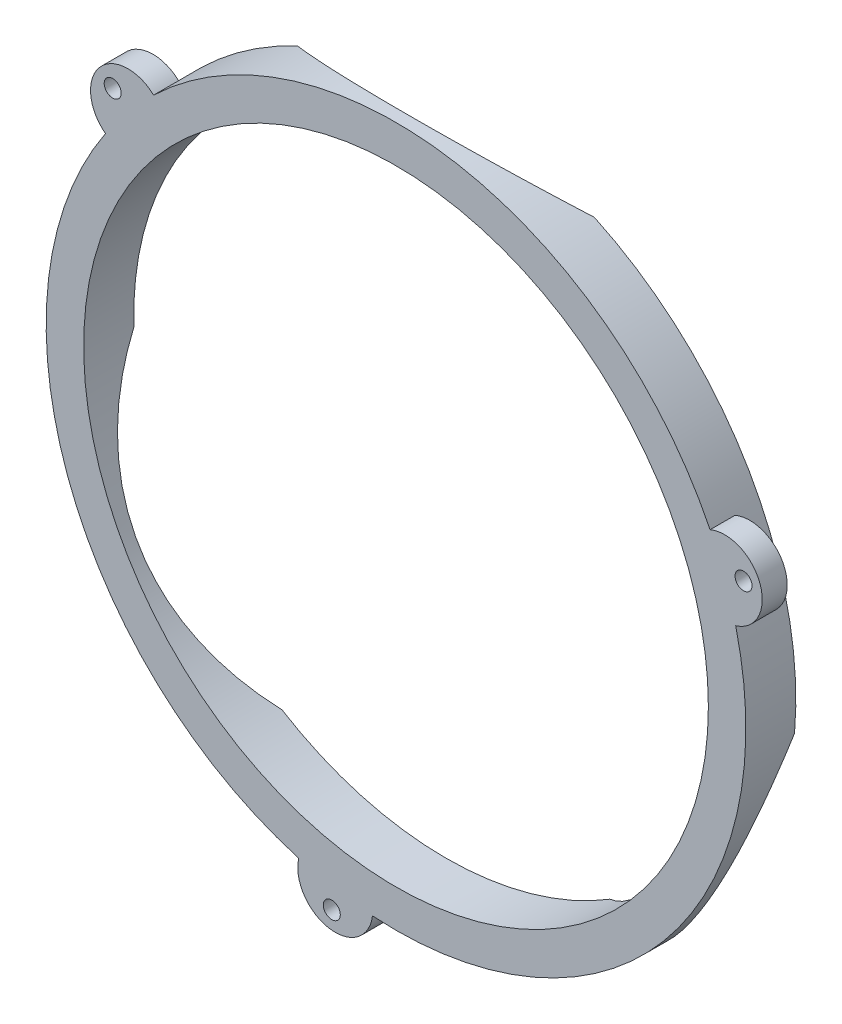
ISO-10303-21;
HEADER;
FILE_DESCRIPTION(('STEP AP214'),'2;1');
FILE_NAME('part.step','',(''),(''),'','','');
FILE_SCHEMA(('AUTOMOTIVE_DESIGN { 1 0 10303 214 1 1 1 1 }'));
ENDSEC;
DATA;
#1=APPLICATION_CONTEXT('core data for automotive mechanical design processes');
#2=APPLICATION_PROTOCOL_DEFINITION('international standard','automotive_design',2000,#1);
#3=PRODUCT_CONTEXT('',#1,'mechanical');
#4=PRODUCT('Part','Part','',(#3));
#5=PRODUCT_RELATED_PRODUCT_CATEGORY('part','',(#4));
#6=PRODUCT_DEFINITION_FORMATION('','',#4);
#7=PRODUCT_DEFINITION_CONTEXT('part definition',#1,'design');
#8=PRODUCT_DEFINITION('design','',#6,#7);
#9=PRODUCT_DEFINITION_SHAPE('','',#8);
#10=(LENGTH_UNIT() NAMED_UNIT(*) SI_UNIT(.MILLI.,.METRE.));
#11=(NAMED_UNIT(*) PLANE_ANGLE_UNIT() SI_UNIT($,.RADIAN.));
#12=(NAMED_UNIT(*) SI_UNIT($,.STERADIAN.) SOLID_ANGLE_UNIT());
#13=UNCERTAINTY_MEASURE_WITH_UNIT(LENGTH_MEASURE(1.E-05),#10,'distance_accuracy_value','');
#14=(GEOMETRIC_REPRESENTATION_CONTEXT(3) GLOBAL_UNCERTAINTY_ASSIGNED_CONTEXT((#13)) GLOBAL_UNIT_ASSIGNED_CONTEXT((#10,
#11,#12)) REPRESENTATION_CONTEXT('',''));
#15=CARTESIAN_POINT('',(0.,0.,0.));
#16=DIRECTION('',(0.,0.,1.));
#17=DIRECTION('',(1.,0.,0.));
#18=AXIS2_PLACEMENT_3D('',#15,#16,#17);
#19=CARTESIAN_POINT('',(0.,0.,0.));
#20=DIRECTION('',(0.,0.,1.));
#21=DIRECTION('',(1.,0.,0.));
#22=AXIS2_PLACEMENT_3D('',#19,#20,#21);
#23=PLANE('',#22);
#24=CARTESIAN_POINT('',(0.,0.,0.));
#25=DIRECTION('',(0.,0.,1.));
#26=DIRECTION('',(1.,0.,0.));
#27=AXIS2_PLACEMENT_3D('',#24,#25,#26);
#28=CIRCLE('',#27,62.5);
#29=CARTESIAN_POINT('',(-32.7884695993469,-53.2087047515038,0.));
#30=VERTEX_POINT('',#29);
#31=CARTESIAN_POINT('',(32.7884695993469,-53.2087047515038,0.));
#32=VERTEX_POINT('',#31);
#33=EDGE_CURVE('E148',#30,#32,#28,.T.);
#34=ORIENTED_EDGE('',*,*,#33,.T.);
#35=DIRECTION('',(0.86602540378444,-0.499999999999998,0.));
#36=VECTOR('',#35,1.);
#37=CARTESIAN_POINT('',(19.7980885425803,-45.7087047515039,0.));
#38=LINE('',#37,#36);
#39=CARTESIAN_POINT('',(40.0575505311971,-57.4055105842687,0.));
#40=VERTEX_POINT('',#39);
#41=EDGE_CURVE('E61',#32,#40,#38,.T.);
#42=ORIENTED_EDGE('',*,*,#41,.T.);
#43=CARTESIAN_POINT('',(0.,0.,0.));
#44=DIRECTION('',(0.,0.,1.));
#45=DIRECTION('',(1.,0.,0.));
#46=AXIS2_PLACEMENT_3D('',#43,#44,#45);
#47=CIRCLE('',#46,70.);
#48=CARTESIAN_POINT('',(-40.0575505311971,-57.4055105842688,0.));
#49=VERTEX_POINT('',#48);
#50=EDGE_CURVE('E162',#49,#40,#47,.T.);
#51=ORIENTED_EDGE('',*,*,#50,.F.);
#52=DIRECTION('',(-0.86602540378444,-0.499999999999998,0.));
#53=VECTOR('',#52,1.);
#54=CARTESIAN_POINT('',(-19.7980885425803,-45.7087047515039,0.));
#55=LINE('',#54,#53);
#56=EDGE_CURVE('E332',#49,#30,#55,.F.);
#57=ORIENTED_EDGE('',*,*,#56,.T.);
#58=EDGE_LOOP('',(#34,#42,#51,#57));
#59=FACE_BOUND('',#58,.T.);
#60=ADVANCED_FACE('F38',(#59),#23,.F.);
#61=CARTESIAN_POINT('',(69.7434057487918,-5.98810108126087,0.));
#62=VERTEX_POINT('',#61);
#63=CARTESIAN_POINT('',(29.6858552175943,63.3936116655301,0.));
#64=VERTEX_POINT('',#63);
#65=EDGE_CURVE('E160',#62,#64,#47,.T.);
#66=ORIENTED_EDGE('',*,*,#65,.F.);
#67=DIRECTION('',(0.86602540378444,-0.499999999999998,0.));
#68=VECTOR('',#67,1.);
#69=CARTESIAN_POINT('',(49.4839437601749,5.708704751504,0.));
#70=LINE('',#69,#68);
#71=CARTESIAN_POINT('',(62.4743248169415,-1.79129524849596,0.));
#72=VERTEX_POINT('',#71);
#73=EDGE_CURVE('E290',#62,#72,#70,.F.);
#74=ORIENTED_EDGE('',*,*,#73,.T.);
#75=CARTESIAN_POINT('',(29.6858552175944,55.0000000000002,0.));
#76=VERTEX_POINT('',#75);
#77=EDGE_CURVE('E145',#72,#76,#28,.T.);
#78=ORIENTED_EDGE('',*,*,#77,.T.);
#79=DIRECTION('',(0.,1.,0.));
#80=VECTOR('',#79,1.);
#81=CARTESIAN_POINT('',(29.6858552175945,40.0000000000002,0.));
#82=LINE('',#81,#80);
#83=EDGE_CURVE('E54',#76,#64,#82,.T.);
#84=ORIENTED_EDGE('',*,*,#83,.T.);
#85=EDGE_LOOP('',(#66,#74,#78,#84));
#86=FACE_BOUND('',#85,.T.);
#87=ADVANCED_FACE('F247',(#86),#23,.F.);
#88=CARTESIAN_POINT('',(-26.8115555091644,22.4975663390287,5.));
#89=DIRECTION('',(0.,0.,1.));
#90=DIRECTION('',(1.,0.,0.));
#91=AXIS2_PLACEMENT_3D('',#88,#89,#90);
#92=PLANE('',#91);
#93=CARTESIAN_POINT('',(-53.6231110183289,44.9951326780573,5.));
#94=DIRECTION('',(0.,0.,1.));
#95=DIRECTION('',(1.,0.,0.));
#96=AXIS2_PLACEMENT_3D('',#93,#94,#95);
#97=CIRCLE('',#96,7.5);
#98=CARTESIAN_POINT('',(-48.5013409580594,50.4739529388185,5.));
#99=VERTEX_POINT('',#98);
#100=CARTESIAN_POINT('',(-58.1293096510919,38.9997866595123,5.));
#101=VERTEX_POINT('',#100);
#102=EDGE_CURVE('E201',#99,#101,#97,.T.);
#103=ORIENTED_EDGE('',*,*,#102,.F.);
#104=CARTESIAN_POINT('',(0.,0.,5.));
#105=DIRECTION('',(0.,0.,1.));
#106=DIRECTION('',(1.,0.,0.));
#107=AXIS2_PLACEMENT_3D('',#104,#105,#106);
#108=CIRCLE('',#107,70.);
#109=EDGE_CURVE('E196',#99,#101,#108,.T.);
#110=ORIENTED_EDGE('',*,*,#109,.T.);
#111=EDGE_LOOP('',(#103,#110));
#112=FACE_BOUND('',#111,.T.);
#113=CARTESIAN_POINT('',(-56.6872887908048,47.5662831168035,5.));
#114=DIRECTION('',(0.,0.,-1.));
#115=DIRECTION('',(-1.,0.,0.));
#116=AXIS2_PLACEMENT_3D('',#113,#114,#115);
#117=CIRCLE('',#116,1.69999999999999);
#118=CARTESIAN_POINT('',(-58.3872887908047,47.5662831168035,5.));
#119=VERTEX_POINT('',#118);
#120=EDGE_CURVE('E214',#119,#119,#117,.T.);
#121=ORIENTED_EDGE('',*,*,#120,.F.);
#122=EDGE_LOOP('',(#121));
#123=FACE_BOUND('',#122,.T.);
#124=ADVANCED_FACE('F243',(#112,#123),#92,.F.);
#125=CARTESIAN_POINT('',(32.8892417275068,11.9707050163985,5.));
#126=DIRECTION('',(0.,0.,1.));
#127=DIRECTION('',(1.,0.,0.));
#128=AXIS2_PLACEMENT_3D('',#125,#126,#127);
#129=PLANE('',#128);
#130=CARTESIAN_POINT('',(65.7784834550136,23.9414100327971,5.));
#131=DIRECTION('',(0.,0.,1.));
#132=DIRECTION('',(1.,0.,0.));
#133=AXIS2_PLACEMENT_3D('',#130,#131,#132);
#134=CIRCLE('',#133,7.5);
#135=CARTESIAN_POINT('',(67.9623959534669,16.7664169178806,5.));
#136=VERTEX_POINT('',#135);
#137=CARTESIAN_POINT('',(62.8394608148572,30.8415655325411,5.));
#138=VERTEX_POINT('',#137);
#139=EDGE_CURVE('E188',#136,#138,#134,.T.);
#140=ORIENTED_EDGE('',*,*,#139,.F.);
#141=CARTESIAN_POINT('',(0.,0.,5.));
#142=DIRECTION('',(0.,0.,1.));
#143=DIRECTION('',(1.,0.,0.));
#144=AXIS2_PLACEMENT_3D('',#141,#142,#143);
#145=CIRCLE('',#144,70.);
#146=EDGE_CURVE('E183',#136,#138,#145,.T.);
#147=ORIENTED_EDGE('',*,*,#146,.T.);
#148=EDGE_LOOP('',(#140,#147));
#149=FACE_BOUND('',#148,.T.);
#150=CARTESIAN_POINT('',(69.5372539381571,25.3094906060997,5.));
#151=DIRECTION('',(0.,0.,-1.));
#152=DIRECTION('',(-1.,0.,0.));
#153=AXIS2_PLACEMENT_3D('',#150,#151,#152);
#154=CIRCLE('',#153,1.69999999999999);
#155=CARTESIAN_POINT('',(67.8372539381571,25.3094906060997,5.));
#156=VERTEX_POINT('',#155);
#157=EDGE_CURVE('E208',#156,#156,#154,.T.);
#158=ORIENTED_EDGE('',*,*,#157,.F.);
#159=EDGE_LOOP('',(#158));
#160=FACE_BOUND('',#159,.T.);
#161=ADVANCED_FACE('F246',(#149,#160),#129,.F.);
#162=CARTESIAN_POINT('',(-6.0776862183426,-34.4682713554273,5.));
#163=DIRECTION('',(0.,0.,1.));
#164=DIRECTION('',(1.,0.,0.));
#165=AXIS2_PLACEMENT_3D('',#162,#163,#164);
#166=PLANE('',#165);
#167=CARTESIAN_POINT('',(-12.1553724366852,-68.9365427108546,5.));
#168=DIRECTION('',(0.,0.,1.));
#169=DIRECTION('',(1.,0.,0.));
#170=AXIS2_PLACEMENT_3D('',#167,#168,#169);
#171=CIRCLE('',#170,7.5);
#172=CARTESIAN_POINT('',(-19.461054995408,-67.2403698566992,5.));
#173=VERTEX_POINT('',#172);
#174=CARTESIAN_POINT('',(-4.71015116376576,-69.8413521920536,5.));
#175=VERTEX_POINT('',#174);
#176=EDGE_CURVE('E169',#173,#175,#171,.T.);
#177=ORIENTED_EDGE('',*,*,#176,.F.);
#178=CARTESIAN_POINT('',(0.,0.,5.));
#179=DIRECTION('',(0.,0.,1.));
#180=DIRECTION('',(1.,0.,0.));
#181=AXIS2_PLACEMENT_3D('',#178,#179,#180);
#182=CIRCLE('',#181,70.);
#183=EDGE_CURVE('E165',#173,#175,#182,.T.);
#184=ORIENTED_EDGE('',*,*,#183,.T.);
#185=EDGE_LOOP('',(#177,#184));
#186=FACE_BOUND('',#185,.T.);
#187=CARTESIAN_POINT('',(-12.8499651473529,-72.8757737229034,5.));
#188=DIRECTION('',(0.,0.,-1.));
#189=DIRECTION('',(-1.,0.,0.));
#190=AXIS2_PLACEMENT_3D('',#187,#188,#189);
#191=CIRCLE('',#190,1.69999999999999);
#192=CARTESIAN_POINT('',(-14.5499651473529,-72.8757737229034,5.));
#193=VERTEX_POINT('',#192);
#194=EDGE_CURVE('E176',#193,#193,#191,.T.);
#195=ORIENTED_EDGE('',*,*,#194,.F.);
#196=EDGE_LOOP('',(#195));
#197=FACE_BOUND('',#196,.T.);
#198=ADVANCED_FACE('F255',(#186,#197),#166,.F.);
#199=CARTESIAN_POINT('',(0.,0.,10.));
#200=DIRECTION('',(0.,0.,1.));
#201=DIRECTION('',(1.,0.,0.));
#202=AXIS2_PLACEMENT_3D('',#199,#200,#201);
#203=PLANE('',#202);
#204=CARTESIAN_POINT('',(-56.6872887908048,47.5662831168035,10.));
#205=DIRECTION('',(0.,0.,1.));
#206=DIRECTION('',(1.,0.,0.));
#207=AXIS2_PLACEMENT_3D('',#204,#205,#206);
#208=CIRCLE('',#207,1.69999999999999);
#209=CARTESIAN_POINT('',(-54.9872887908048,47.5662831168035,10.));
#210=VERTEX_POINT('',#209);
#211=EDGE_CURVE('E211',#210,#210,#208,.T.);
#212=ORIENTED_EDGE('',*,*,#211,.F.);
#213=EDGE_LOOP('',(#212));
#214=FACE_BOUND('',#213,.T.);
#215=CARTESIAN_POINT('',(69.5372539381571,25.3094906060997,10.));
#216=DIRECTION('',(0.,0.,1.));
#217=DIRECTION('',(1.,0.,0.));
#218=AXIS2_PLACEMENT_3D('',#215,#216,#217);
#219=CIRCLE('',#218,1.69999999999999);
#220=CARTESIAN_POINT('',(71.2372539381571,25.3094906060997,10.));
#221=VERTEX_POINT('',#220);
#222=EDGE_CURVE('E202',#221,#221,#219,.T.);
#223=ORIENTED_EDGE('',*,*,#222,.F.);
#224=EDGE_LOOP('',(#223));
#225=FACE_BOUND('',#224,.T.);
#226=CARTESIAN_POINT('',(-12.8499651473529,-72.8757737229034,10.));
#227=DIRECTION('',(0.,0.,1.));
#228=DIRECTION('',(1.,0.,0.));
#229=AXIS2_PLACEMENT_3D('',#226,#227,#228);
#230=CIRCLE('',#229,1.69999999999999);
#231=CARTESIAN_POINT('',(-11.1499651473529,-72.8757737229034,10.));
#232=VERTEX_POINT('',#231);
#233=EDGE_CURVE('E170',#232,#232,#230,.T.);
#234=ORIENTED_EDGE('',*,*,#233,.F.);
#235=EDGE_LOOP('',(#234));
#236=FACE_BOUND('',#235,.T.);
#237=CARTESIAN_POINT('',(0.,0.,10.));
#238=DIRECTION('',(0.,0.,1.));
#239=DIRECTION('',(1.,0.,0.));
#240=AXIS2_PLACEMENT_3D('',#237,#238,#239);
#241=CIRCLE('',#240,70.);
#242=CARTESIAN_POINT('',(-4.71015116376576,-69.8413521920537,10.));
#243=VERTEX_POINT('',#242);
#244=CARTESIAN_POINT('',(67.9623959534669,16.7664169178806,10.));
#245=VERTEX_POINT('',#244);
#246=EDGE_CURVE('E295',#243,#245,#241,.T.);
#247=ORIENTED_EDGE('',*,*,#246,.T.);
#248=CARTESIAN_POINT('',(65.7784834550136,23.9414100327971,10.));
#249=DIRECTION('',(0.,0.,1.));
#250=DIRECTION('',(1.,0.,0.));
#251=AXIS2_PLACEMENT_3D('',#248,#249,#250);
#252=CIRCLE('',#251,7.5);
#253=CARTESIAN_POINT('',(62.8394608148572,30.8415655325411,10.));
#254=VERTEX_POINT('',#253);
#255=EDGE_CURVE('E186',#245,#254,#252,.T.);
#256=ORIENTED_EDGE('',*,*,#255,.T.);
#257=CARTESIAN_POINT('',(-48.5013409580594,50.4739529388185,10.));
#258=VERTEX_POINT('',#257);
#259=EDGE_CURVE('E298',#254,#258,#241,.T.);
#260=ORIENTED_EDGE('',*,*,#259,.T.);
#261=CARTESIAN_POINT('',(-53.6231110183289,44.9951326780573,10.));
#262=DIRECTION('',(0.,0.,1.));
#263=DIRECTION('',(1.,0.,0.));
#264=AXIS2_PLACEMENT_3D('',#261,#262,#263);
#265=CIRCLE('',#264,7.5);
#266=CARTESIAN_POINT('',(-58.129309651092,38.9997866595123,10.));
#267=VERTEX_POINT('',#266);
#268=EDGE_CURVE('E199',#258,#267,#265,.T.);
#269=ORIENTED_EDGE('',*,*,#268,.T.);
#270=CARTESIAN_POINT('',(-19.461054995408,-67.2403698566992,10.));
#271=VERTEX_POINT('',#270);
#272=EDGE_CURVE('E293',#267,#271,#241,.T.);
#273=ORIENTED_EDGE('',*,*,#272,.T.);
#274=CARTESIAN_POINT('',(-12.1553724366852,-68.9365427108546,10.));
#275=DIRECTION('',(0.,0.,1.));
#276=DIRECTION('',(1.,0.,0.));
#277=AXIS2_PLACEMENT_3D('',#274,#275,#276);
#278=CIRCLE('',#277,7.5);
#279=EDGE_CURVE('E167',#271,#243,#278,.T.);
#280=ORIENTED_EDGE('',*,*,#279,.T.);
#281=EDGE_LOOP('',(#247,#256,#260,#269,#273,#280));
#282=FACE_BOUND('',#281,.T.);
#283=CARTESIAN_POINT('',(0.,0.,10.));
#284=DIRECTION('',(0.,0.,1.));
#285=DIRECTION('',(1.,0.,0.));
#286=AXIS2_PLACEMENT_3D('',#283,#284,#285);
#287=CIRCLE('',#286,62.5);
#288=CARTESIAN_POINT('',(62.5,0.,10.));
#289=VERTEX_POINT('',#288);
#290=EDGE_CURVE('E155',#289,#289,#287,.T.);
#291=ORIENTED_EDGE('',*,*,#290,.F.);
#292=EDGE_LOOP('',(#291));
#293=FACE_BOUND('',#292,.T.);
#294=ADVANCED_FACE('F267',(#214,#225,#236,#282,#293),#203,.T.);
#295=CARTESIAN_POINT('',(-29.6858552175952,63.3936116655296,0.));
#296=VERTEX_POINT('',#295);
#297=CARTESIAN_POINT('',(-69.7434057487918,-5.98810108126087,0.));
#298=VERTEX_POINT('',#297);
#299=EDGE_CURVE('E139',#296,#298,#47,.T.);
#300=ORIENTED_EDGE('',*,*,#299,.F.);
#301=DIRECTION('',(0.,1.,0.));
#302=VECTOR('',#301,1.);
#303=CARTESIAN_POINT('',(-29.6858552175951,39.9999999999998,0.));
#304=LINE('',#303,#302);
#305=CARTESIAN_POINT('',(-29.6858552175952,54.9999999999998,0.));
#306=VERTEX_POINT('',#305);
#307=EDGE_CURVE('E127',#296,#306,#304,.F.);
#308=ORIENTED_EDGE('',*,*,#307,.T.);
#309=CARTESIAN_POINT('',(-62.4743248169415,-1.79129524849595,0.));
#310=VERTEX_POINT('',#309);
#311=EDGE_CURVE('E137',#306,#310,#28,.T.);
#312=ORIENTED_EDGE('',*,*,#311,.T.);
#313=DIRECTION('',(-0.86602540378444,-0.499999999999998,0.));
#314=VECTOR('',#313,1.);
#315=CARTESIAN_POINT('',(-49.4839437601749,5.708704751504,0.));
#316=LINE('',#315,#314);
#317=EDGE_CURVE('E224',#310,#298,#316,.T.);
#318=ORIENTED_EDGE('',*,*,#317,.T.);
#319=EDGE_LOOP('',(#300,#308,#312,#318));
#320=FACE_BOUND('',#319,.T.);
#321=ADVANCED_FACE('F135',(#320),#23,.F.);
#322=CARTESIAN_POINT('',(0.,0.,10.));
#323=DIRECTION('',(0.,0.,-1.));
#324=DIRECTION('',(-1.,0.,0.));
#325=AXIS2_PLACEMENT_3D('',#322,#323,#324);
#326=CYLINDRICAL_SURFACE('',#325,70.);
#327=ORIENTED_EDGE('',*,*,#109,.F.);
#328=DIRECTION('',(0.,0.,1.));
#329=VECTOR('',#328,1.);
#330=CARTESIAN_POINT('',(-48.5013409580594,50.4739529388185,5.));
#331=LINE('',#330,#329);
#332=EDGE_CURVE('E189',#99,#258,#331,.T.);
#333=ORIENTED_EDGE('',*,*,#332,.T.);
#334=ORIENTED_EDGE('',*,*,#259,.F.);
#335=DIRECTION('',(0.,0.,1.));
#336=VECTOR('',#335,1.);
#337=CARTESIAN_POINT('',(62.8394608148572,30.8415655325411,5.));
#338=LINE('',#337,#336);
#339=EDGE_CURVE('E180',#138,#254,#338,.T.);
#340=ORIENTED_EDGE('',*,*,#339,.F.);
#341=ORIENTED_EDGE('',*,*,#146,.F.);
#342=DIRECTION('',(0.,0.,1.));
#343=VECTOR('',#342,1.);
#344=CARTESIAN_POINT('',(67.9623959534669,16.7664169178806,5.));
#345=LINE('',#344,#343);
#346=EDGE_CURVE('E179',#136,#245,#345,.T.);
#347=ORIENTED_EDGE('',*,*,#346,.T.);
#348=ORIENTED_EDGE('',*,*,#246,.F.);
#349=DIRECTION('',(0.,0.,1.));
#350=VECTOR('',#349,1.);
#351=CARTESIAN_POINT('',(-4.71015116376576,-69.8413521920536,5.));
#352=LINE('',#351,#350);
#353=EDGE_CURVE('E150',#175,#243,#352,.T.);
#354=ORIENTED_EDGE('',*,*,#353,.F.);
#355=ORIENTED_EDGE('',*,*,#183,.F.);
#356=DIRECTION('',(0.,0.,1.));
#357=VECTOR('',#356,1.);
#358=CARTESIAN_POINT('',(-19.461054995408,-67.2403698566992,5.));
#359=LINE('',#358,#357);
#360=EDGE_CURVE('E146',#173,#271,#359,.T.);
#361=ORIENTED_EDGE('',*,*,#360,.T.);
#362=ORIENTED_EDGE('',*,*,#272,.F.);
#363=DIRECTION('',(0.,0.,1.));
#364=VECTOR('',#363,1.);
#365=CARTESIAN_POINT('',(-58.1293096510919,38.9997866595123,5.));
#366=LINE('',#365,#364);
#367=EDGE_CURVE('E193',#101,#267,#366,.T.);
#368=ORIENTED_EDGE('',*,*,#367,.F.);
#369=EDGE_LOOP('',(#327,#333,#334,#340,#341,#347,#348,#354,#355,#361,#362,#368));
#370=FACE_BOUND('',#369,.T.);
#371=ORIENTED_EDGE('',*,*,#50,.T.);
#372=CARTESIAN_POINT('',(5.9182029186876,-69.749371855331,-30.3778554955098));
#373=CARTESIAN_POINT('',(6.31484149570612,-69.7157263904104,-29.8472070250956));
#374=CARTESIAN_POINT('',(6.71773765752362,-69.6781244892094,-29.3215140449993));
#375=CARTESIAN_POINT('',(7.53487679534848,-69.5944965867276,-28.2797450774848));
#376=CARTESIAN_POINT('',(7.94911917458296,-69.5484710277822,-27.7636685866615));
#377=CARTESIAN_POINT('',(8.78775741203566,-69.4474892088401,-26.7408645114382));
#378=CARTESIAN_POINT('',(9.21215164077977,-69.3925343739879,-26.2341354495027));
#379=CARTESIAN_POINT('',(10.0701844129512,-69.2732202892359,-25.2296988933929));
#380=CARTESIAN_POINT('',(10.5038230982167,-69.2088608949524,-24.7319915378563));
#381=CARTESIAN_POINT('',(11.8184970052836,-69.0008027494828,-23.2507067447942));
#382=CARTESIAN_POINT('',(12.7121661663452,-68.8422563068114,-22.280330296218));
#383=CARTESIAN_POINT('',(14.5270467962894,-68.4822690963951,-20.3739024089243));
#384=CARTESIAN_POINT('',(15.4482596204957,-68.2808262148764,-19.4378526643618));
#385=CARTESIAN_POINT('',(17.3228405170023,-67.8296255970889,-17.590443484262));
#386=CARTESIAN_POINT('',(18.2764414764339,-67.5793935286434,-16.6794357353063));
#387=CARTESIAN_POINT('',(20.2021899983048,-67.0289082949837,-14.892772217949));
#388=CARTESIAN_POINT('',(21.1743378015674,-66.7286544798654,-14.0171169090453));
#389=CARTESIAN_POINT('',(23.132330486881,-66.0754085068067,-12.3029851068488));
#390=CARTESIAN_POINT('',(24.1181649659889,-65.7224546067172,-11.4644822105371));
#391=CARTESIAN_POINT('',(26.1000452412946,-64.960870127397,-9.8259679695846));
#392=CARTESIAN_POINT('',(27.0960898374178,-64.5522460236752,-9.02595216278302));
#393=CARTESIAN_POINT('',(29.4060676821653,-63.5399928129061,-7.22361990291038));
#394=CARTESIAN_POINT('',(30.7223242017183,-62.9152793278979,-6.23596363048639));
#395=CARTESIAN_POINT('',(33.3558697523206,-61.55955772827,-4.3380216824035));
#396=CARTESIAN_POINT('',(34.6731586735209,-60.8285597074138,-3.4277286726063));
#397=CARTESIAN_POINT('',(37.2931013414597,-59.2583149100963,-1.6964454371918));
#398=CARTESIAN_POINT('',(38.5957919596104,-58.4194970367925,-0.875123942026196));
#399=CARTESIAN_POINT('',(41.1794640796881,-56.6279215536609,0.672084612601793));
#400=CARTESIAN_POINT('',(42.4604493408212,-55.675183909006,1.39798834796251));
#401=CARTESIAN_POINT('',(44.757381686404,-53.8379936403103,2.62105975850668));
#402=CARTESIAN_POINT('',(45.7792050907559,-52.972573637459,3.1358249735337));
#403=CARTESIAN_POINT('',(47.7907976678636,-51.1650976631315,4.08774221346354));
#404=CARTESIAN_POINT('',(48.7805703528219,-50.2230501287073,4.52490276618264));
#405=CARTESIAN_POINT('',(50.7193160323263,-48.2643734812208,5.31548599889334));
#406=CARTESIAN_POINT('',(51.6682851324691,-47.2477372741659,5.66890070041398));
#407=CARTESIAN_POINT('',(53.5161418248328,-45.1440173669395,6.28628450389929));
#408=CARTESIAN_POINT('',(54.4150288280409,-44.0569328385542,6.55025255407215));
#409=CARTESIAN_POINT('',(56.1579930101882,-41.812775963112,6.98515927976403));
#410=CARTESIAN_POINT('',(57.0017713764037,-40.6553787332731,7.15562277450551));
#411=CARTESIAN_POINT('',(58.6209456659412,-38.2837579718298,7.39820726991709));
#412=CARTESIAN_POINT('',(59.3963414650226,-37.0695343369866,7.47032809191698));
#413=CARTESIAN_POINT('',(60.8712104520707,-34.5943753802657,7.51478700648723));
#414=CARTESIAN_POINT('',(61.5706982564778,-33.3334491141426,7.48714434422673));
#415=CARTESIAN_POINT('',(62.888195343591,-30.7757062684411,7.33266751578066));
#416=CARTESIAN_POINT('',(63.5062087890239,-29.4788915265929,7.20583841957254));
#417=CARTESIAN_POINT('',(64.6087207761916,-26.9709011581667,6.87022674337899));
#418=CARTESIAN_POINT('',(65.1000729371002,-25.7616780333028,6.66921993017558));
#419=CARTESIAN_POINT('',(66.0100170293705,-23.3315425679126,6.1892405410149));
#420=CARTESIAN_POINT('',(66.4286139424641,-22.1106310337653,5.91027330661449));
#421=CARTESIAN_POINT('',(67.1931294045195,-19.66531545355,5.27838264915873));
#422=CARTESIAN_POINT('',(67.5390482078579,-18.440911419721,4.92545948496092));
#423=CARTESIAN_POINT('',(68.1595041070592,-15.9960294966217,4.15024133536252));
#424=CARTESIAN_POINT('',(68.4340367914709,-14.7755518545917,3.72794206535386));
#425=CARTESIAN_POINT('',(68.9309503467061,-12.2590188212044,2.7866361674662));
#426=CARTESIAN_POINT('',(69.1482577849443,-10.9637356317389,2.26289748700554));
#427=CARTESIAN_POINT('',(69.5072408083631,-8.3922120292806,1.14750789446722));
#428=CARTESIAN_POINT('',(69.6489148464088,-7.11597200634841,0.555855593468889));
#429=CARTESIAN_POINT('',(69.861057667752,-4.5873424902562,-0.690023417015011));
#430=CARTESIAN_POINT('',(69.9314742716762,-3.33497113275861,-1.34429559771347));
#431=CARTESIAN_POINT('',(70.0056757797302,-0.859553334926287,-2.70980433916668));
#432=CARTESIAN_POINT('',(70.0094530749491,0.363489740768551,-3.42104739557227));
#433=CARTESIAN_POINT('',(69.9616384225649,2.49524166454274,-4.72390870012264));
#434=CARTESIAN_POINT('',(69.9227326588782,3.41083921055597,-5.30482548797036));
#435=CARTESIAN_POINT('',(69.8109124094167,5.22098770662377,-6.49546223165851));
#436=CARTESIAN_POINT('',(69.7379979769922,6.1155386896923,-7.10518214231339));
#437=CARTESIAN_POINT('',(69.560420952599,7.8826927684388,-8.35205221693209));
#438=CARTESIAN_POINT('',(69.4557431228898,8.75528511192197,-8.98921542000808));
#439=CARTESIAN_POINT('',(69.2169778251573,10.4768875388122,-10.2892804129949));
#440=CARTESIAN_POINT('',(69.0828912341192,11.3258983245837,-10.9521814349049));
#441=CARTESIAN_POINT('',(68.7874816134207,13.0002253251751,-12.3033717695801));
#442=CARTESIAN_POINT('',(68.6261273300365,13.825513064448,-12.9916894989119));
#443=CARTESIAN_POINT('',(68.2786814502784,15.4503017461773,-14.3921276813001));
#444=CARTESIAN_POINT('',(68.0925891832638,16.2498019888105,-15.104248779268));
#445=CARTESIAN_POINT('',(67.6982102515772,17.8215758663912,-16.5514144280462));
#446=CARTESIAN_POINT('',(67.4899315547056,18.5938591440341,-17.2864506827178));
#447=CARTESIAN_POINT('',(67.053726691808,20.1101978223956,-18.7793222502196));
#448=CARTESIAN_POINT('',(66.8258020164512,20.8542553586277,-19.5371558304316));
#449=CARTESIAN_POINT('',(66.3462739353452,22.333690471251,-21.0977365935947));
#450=CARTESIAN_POINT('',(66.0941790799868,23.0682079522793,-21.9011485238818));
#451=CARTESIAN_POINT('',(65.5754646567661,24.503894360391,-23.532326948877));
#452=CARTESIAN_POINT('',(65.3088486609907,25.2050714101783,-24.3600874311946));
#453=CARTESIAN_POINT('',(64.7659041905087,26.5690406776064,-26.0373253397897));
#454=CARTESIAN_POINT('',(64.4896228264872,27.2319861081694,-26.8866930753888));
#455=CARTESIAN_POINT('',(64.0702679933801,28.1979457579408,-28.1805658967956));
#456=CARTESIAN_POINT('',(63.9296334614191,28.5152473720472,-28.6152456763642));
#457=CARTESIAN_POINT('',(63.6473431195069,29.1398915705943,-29.491401541382));
#458=CARTESIAN_POINT('',(63.5056872704546,29.4472337712375,-29.9328778877799));
#459=CARTESIAN_POINT('',(63.3638293840676,29.7493718553311,-30.3778554955098));
#460=B_SPLINE_CURVE_WITH_KNOTS('',3,(#372,#373,#374,#375,#376,#377,#378,#379,#380,#381,#382,
#383,#384,#385,#386,#387,#388,#389,#390,#391,#392,#393,#394,#395,#396,#397,#398,#399,#400,#401,
#402,#403,#404,#405,#406,#407,#408,#409,#410,#411,#412,#413,#414,#415,#416,#417,#418,#419,#420,
#421,#422,#423,#424,#425,#426,#427,#428,#429,#430,#431,#432,#433,#434,#435,#436,#437,#438,#439,
#440,#441,#442,#443,#444,#445,#446,#447,#448,#449,#450,#451,#452,#453,#454,#455,#456,#457,#458,
#459),.UNSPECIFIED.,.F.,.F.,(4,2,2,2,2,2,2,2,2,2,2,2,2,2,2,2,2,2,2,2,2,2,2,2,2,2,2,2,2,2,2,2,2,
2,2,2,2,2,2,2,2,2,2,4),(0.,1.98997734105155,3.97985021621773,5.96940581194739,7.95899195555215,
11.9434752069455,15.928154844005,19.9537017074987,23.9793008767132,28.0019917273951,
32.0242150611099,37.3000330225726,42.5753502703935,47.8302968555172,53.0843238236051,
57.383968602145,61.6831406087195,65.982722033078,70.2823540139139,74.6036385044203,
78.9249308458803,83.245389620259,87.565627566082,91.5231007487494,95.4803028465882,
99.4374910938216,103.394923825506,107.63275799465,111.870678848386,116.111700745387,
120.353206881351,123.607216186925,126.861220387867,130.116788095131,133.372258732793,
136.631486357529,139.89080235716,143.148951761701,146.406854166339,149.75813834374,
153.10860182248,156.444541938965,158.113152415844,159.781827118274),.UNSPECIFIED.);
#461=EDGE_CURVE('E330',#40,#62,#460,.T.);
#462=ORIENTED_EDGE('',*,*,#461,.T.);
#463=ORIENTED_EDGE('',*,*,#65,.T.);
#464=CARTESIAN_POINT('',(57.44562646538,40.0000000000004,-30.3778554955098));
#465=CARTESIAN_POINT('',(57.2181693495274,40.3266763513591,-29.8472070250956));
#466=CARTESIAN_POINT('',(56.984157066948,40.6567937119798,-29.3215140449994));
#467=CARTESIAN_POINT('',(56.5031636100211,41.3226430125217,-28.2797450774849));
#468=CARTESIAN_POINT('',(56.2561831171337,41.6583746567902,-27.7636685866615));
#469=CARTESIAN_POINT('',(55.7494111778832,42.3341657655382,-26.7408645114382));
#470=CARTESIAN_POINT('',(55.4896217804684,42.674224531424,-26.2341354495027));
#471=CARTESIAN_POINT('',(54.9572763659581,43.357645667028,-25.2296988933929));
#472=CARTESIAN_POINT('',(54.6847201529037,43.7010080873899,-24.7319915378563));
#473=CARTESIAN_POINT('',(53.8471995599293,44.7355200158676,-23.2507067447942));
#474=CARTESIAN_POINT('',(53.2630597323654,45.4301869905899,-22.280330296218));
#475=CARTESIAN_POINT('',(52.0438613481353,46.8219261157497,-20.3739024089243));
#476=CARTESIAN_POINT('',(51.4088002832254,47.518998383045,-19.4378526643618));
#477=CARTESIAN_POINT('',(50.0807586377649,48.916832751975,-17.590443484262));
#478=CARTESIAN_POINT('',(49.3872508299337,49.6175593736932,-16.6794357353063));
#479=CARTESIAN_POINT('',(47.9476423722408,51.0100638981039,-14.892772217949));
#480=CARTESIAN_POINT('',(47.2015410391339,51.7018416844034,-14.0171169090454));
#481=CARTESIAN_POINT('',(45.6568170888883,53.0708901037797,-12.3029851068488));
#482=CARTESIAN_POINT('',(44.858232805492,53.748170856569,-11.4644822105371));
#483=CARTESIAN_POINT('',(43.20774116162,55.083737282583,-9.82596796958462));
#484=CARTESIAN_POINT('',(42.3558400091366,55.742025154267,-9.02595216278304));
#485=CARTESIAN_POINT('',(40.3242140911745,57.2363980446129,-7.2236199029104));
#486=CARTESIAN_POINT('',(39.1250680832941,58.0639528859387,-6.23596363048641));
#487=CARTESIAN_POINT('',(36.634205962256,59.6668094349698,-4.33802168240351));
#488=CARTESIAN_POINT('',(35.3424986454781,60.4421160944249,-3.42772867260631));
#489=CARTESIAN_POINT('',(32.6726554268715,61.9259306026599,-1.69644543719181));
#490=CARTESIAN_POINT('',(31.2948725303666,62.6346848345981,-0.87512394202622));
#491=CARTESIAN_POINT('',(28.4514865891384,63.9764227840693,0.672084612601768));
#492=CARTESIAN_POINT('',(26.9858989551589,64.6094197397564,1.3979883479625));
#493=CARTESIAN_POINT('',(24.2463793380915,65.6800263674575,2.62105975850666));
#494=CARTESIAN_POINT('',(22.9859919285031,66.1322413923821,3.13582497353369));
#495=CARTESIAN_POINT('',(20.4148755294517,66.9705936790578,4.08774221346351));
#496=CARTESIAN_POINT('',(19.1041520905886,67.3567382009915,4.52490276618261));
#497=CARTESIAN_POINT('',(16.4385155163137,68.0564028871764,5.31548599889332));
#498=CARTESIAN_POINT('',(15.0835981845258,68.369916131779,5.66890070041397));
#499=CARTESIAN_POINT('',(12.3377949562388,68.9183470163059,6.28628450389928));
#500=CARTESIAN_POINT('',(10.946908636992,69.1532637320231,6.55025255407212));
#501=CARTESIAN_POINT('',(8.13192968170795,69.540636553928,6.98515927976401));
#502=CARTESIAN_POINT('',(6.70770509529001,69.6926714393149,7.1556227745055));
#503=CARTESIAN_POINT('',(3.84423412296874,69.9091071264873,7.3982072699171));
#504=CARTESIAN_POINT('',(2.40498770977838,69.9735077690579,7.47032809191698));
#505=CARTESIAN_POINT('',(-0.47599731867064,70.0132023007349,7.51478700648723));
#506=CARTESIAN_POINT('',(-1.91773539963576,69.9885133759273,7.48714434422674));
#507=CARTESIAN_POINT('',(-4.79155422391782,69.8506278999285,7.33266751578066));
#508=CARTESIAN_POINT('',(-6.22363545707694,69.7374358726297,7.20583841957252));
#509=CARTESIAN_POINT('',(-8.94687482216459,69.4382440772807,6.87022674337898));
#510=CARTESIAN_POINT('',(-10.2397688475947,69.2591559684,6.66921993017558));
#511=CARTESIAN_POINT('',(-12.7992999413953,68.8321229356345,6.18924054101491));
#512=CARTESIAN_POINT('',(-14.0659388022869,68.5841827292456,5.91027330661448));
#513=CARTESIAN_POINT('',(-16.565901946051,68.023614750864,5.27838264915873));
#514=CARTESIAN_POINT('',(-17.7992263455123,67.7109872052872,4.92545948496093));
#515=CARTESIAN_POINT('',(-20.2267841497702,67.0258768143738,4.15024133536254));
#516=CARTESIAN_POINT('',(-21.4210151347251,66.6533902722285,3.72794206535386));
#517=CARTESIAN_POINT('',(-23.8488534487188,65.8254635178534,2.7866361674662));
#518=CARTESIAN_POINT('',(-25.0792553150099,65.3660156850661,2.26289748700555));
#519=CARTESIAN_POINT('',(-27.4857515928795,64.3911423016451,1.14750789446724));
#520=CARTESIAN_POINT('',(-28.661844893088,63.8757156061832,0.555855593468915));
#521=CARTESIAN_POINT('',(-30.9577737014547,62.7951219206509,-0.69002341701499));
#522=CARTESIAN_POINT('',(-32.0775674139816,62.2299188097486,-1.34429559771346));
#523=CARTESIAN_POINT('',(-34.2584428659116,61.0564703018063,-2.70980433916666));
#524=CARTESIAN_POINT('',(-35.3195178869954,60.448219997576,-3.42104739557224));
#525=CARTESIAN_POINT('',(-37.1417618813581,59.3409353320512,-4.72390870012262));
#526=CARTESIAN_POINT('',(-37.9152397340049,58.8494431793382,-5.30482548797034));
#527=CARTESIAN_POINT('',(-39.426964191491,57.8475297546131,-6.49546223165849));
#528=CARTESIAN_POINT('',(-40.1652108515965,57.3371085122967,-7.10518214231336));
#529=CARTESIAN_POINT('',(-41.6068226639956,56.2997452586705,-8.35205221693205));
#530=CARTESIAN_POINT('',(-42.3101708857452,55.7727954271877,-8.98921542000805));
#531=CARTESIAN_POINT('',(-43.6817396737829,54.7052174003641,-10.2892804129948));
#532=CARTESIAN_POINT('',(-44.3499612868289,54.1645896133325,-10.9521814349049));
#533=CARTESIAN_POINT('',(-45.652266193234,53.0715938769895,-12.3033717695801));
#534=CARTESIAN_POINT('',(-46.2863091991841,52.5192130989329,-12.9916894989119));
#535=CARTESIAN_POINT('',(-47.519694533464,51.4059217997575,-14.3921276813));
#536=CARTESIAN_POINT('',(-48.1190359204089,50.8450110477585,-15.1042487792679));
#537=CARTESIAN_POINT('',(-49.2830425615553,49.7175819354102,-16.5514144280461));
#538=CARTESIAN_POINT('',(-49.8477201504761,49.1510656540308,-17.2864506827178));
#539=CARTESIAN_POINT('',(-50.9428055352293,48.0151318223264,-18.7793222502196));
#540=CARTESIAN_POINT('',(-51.4732159258052,47.4457144952021,-19.5371558304316));
#541=CARTESIAN_POINT('',(-52.5146802760346,46.2907134388246,-21.0977365935947));
#542=CARTESIAN_POINT('',(-53.0247436464497,45.7051341494067,-21.9011485238818));
#543=CARTESIAN_POINT('',(-54.0087273361321,44.5380710775323,-23.532326948877));
#544=CARTESIAN_POINT('',(-54.4826564759108,43.9565863272419,-24.3600874311945));
#545=CARTESIAN_POINT('',(-55.3924162762438,42.8043979892461,-26.0373253397897));
#546=CARTESIAN_POINT('',(-55.8284031784234,42.2336585941298,-26.8866930753888));
#547=CARTESIAN_POINT('',(-56.4552713576026,41.3875068305735,-28.1805658967956));
#548=CARTESIAN_POINT('',(-56.6597453501001,41.1070629461927,-28.6152456763642));
#549=CARTESIAN_POINT('',(-57.0595579234124,40.5502702395803,-29.491401541382));
#550=CARTESIAN_POINT('',(-57.2548961522983,40.2739215753847,-29.9328778877799));
#551=CARTESIAN_POINT('',(-57.4456264653806,39.9999999999996,-30.3778554955098));
#552=B_SPLINE_CURVE_WITH_KNOTS('',3,(#464,#465,#466,#467,#468,#469,#470,#471,#472,#473,#474,
#475,#476,#477,#478,#479,#480,#481,#482,#483,#484,#485,#486,#487,#488,#489,#490,#491,#492,#493,
#494,#495,#496,#497,#498,#499,#500,#501,#502,#503,#504,#505,#506,#507,#508,#509,#510,#511,#512,
#513,#514,#515,#516,#517,#518,#519,#520,#521,#522,#523,#524,#525,#526,#527,#528,#529,#530,#531,
#532,#533,#534,#535,#536,#537,#538,#539,#540,#541,#542,#543,#544,#545,#546,#547,#548,#549,#550,
#551),.UNSPECIFIED.,.F.,.F.,(4,2,2,2,2,2,2,2,2,2,2,2,2,2,2,2,2,2,2,2,2,2,2,2,2,2,2,2,2,2,2,2,2,
2,2,2,2,2,2,2,2,2,2,4),(0.,1.98997734105155,3.97985021621773,5.96940581194738,7.95899195555213,
11.9434752069455,15.928154844005,19.9537017074987,23.9793008767132,28.001991727395,
32.0242150611099,37.3000330225726,42.5753502703935,47.8302968555172,53.0843238236051,
57.383968602145,61.6831406087195,65.982722033078,70.2823540139139,74.6036385044203,
78.9249308458803,83.245389620259,87.565627566082,91.5231007487494,95.4803028465882,
99.4374910938216,103.394923825506,107.63275799465,111.870678848386,116.111700745387,
120.353206881351,123.607216186925,126.861220387867,130.116788095131,133.372258732793,
136.631486357529,139.89080235716,143.148951761701,146.406854166339,149.75813834374,
153.10860182248,156.444541938965,158.113152415844,159.781827118275),.UNSPECIFIED.);
#553=EDGE_CURVE('E335',#64,#296,#552,.T.);
#554=ORIENTED_EDGE('',*,*,#553,.T.);
#555=ORIENTED_EDGE('',*,*,#299,.T.);
#556=CARTESIAN_POINT('',(-69.7434057487918,-5.98810108126087,0.));
#557=CARTESIAN_POINT('',(-69.6883166542537,-6.62971437623439,0.314773621120686));
#558=CARTESIAN_POINT('',(-69.6240417913817,-7.27443277204285,0.621504154418248));
#559=CARTESIAN_POINT('',(-69.4765313555416,-8.56951087309545,1.21820048703906));
#560=CARTESIAN_POINT('',(-69.3932938300294,-9.219871152634,1.50816455609821));
#561=CARTESIAN_POINT('',(-69.1141562547745,-11.1791820463239,2.35214737315585));
#562=CARTESIAN_POINT('',(-68.8888989388588,-12.4955550226602,2.87985946210221));
#563=CARTESIAN_POINT('',(-68.3550835467034,-15.1466105151627,3.8609390442918));
#564=CARTESIAN_POINT('',(-68.0461272072273,-16.4813508376524,4.31393399084925));
#565=CARTESIAN_POINT('',(-67.3426771561175,-19.1539077342597,5.13606965679217));
#566=CARTESIAN_POINT('',(-66.948205852077,-20.4917234118526,5.50523229107636));
#567=CARTESIAN_POINT('',(-66.0700102147983,-23.1678030005466,6.15567398775262));
#568=CARTESIAN_POINT('',(-65.5858252905795,-24.50603192873,6.43647837485607));
#569=CARTESIAN_POINT('',(-64.5300063206826,-27.1647563763998,6.9025505882952));
#570=CARTESIAN_POINT('',(-63.9583657600094,-28.4852505667608,7.08781129262004));
#571=CARTESIAN_POINT('',(-62.7321273363336,-31.0925891040705,7.35877728641178));
#572=CARTESIAN_POINT('',(-62.0777951795541,-32.3795259701094,7.44479288049881));
#573=CARTESIAN_POINT('',(-60.6894194708196,-34.912457260209,7.51658635394362));
#574=CARTESIAN_POINT('',(-59.9553834088104,-36.1584555170491,7.50237364395631));
#575=CARTESIAN_POINT('',(-58.4725812365379,-38.5063222585652,7.37891153812806));
#576=CARTESIAN_POINT('',(-57.7291488484521,-39.6119568370832,7.27694733548892));
#577=CARTESIAN_POINT('',(-56.1860504997613,-41.7718705333571,6.98942863001932));
#578=CARTESIAN_POINT('',(-55.3863853395762,-42.8261503817369,6.80387531679666));
#579=CARTESIAN_POINT('',(-53.7359884679195,-44.8796507112572,6.35165821713375));
#580=CARTESIAN_POINT('',(-52.8851439870772,-45.8787395518082,6.08480962607371));
#581=CARTESIAN_POINT('',(-51.1415306786498,-47.8146484647515,5.47417918933969));
#582=CARTESIAN_POINT('',(-50.2487657675506,-48.7514743344906,5.13040451935726));
#583=CARTESIAN_POINT('',(-48.5988342123015,-50.3908934751175,4.44164688028846));
#584=CARTESIAN_POINT('',(-47.8474857558246,-51.1045541472335,4.10888248937714));
#585=CARTESIAN_POINT('',(-46.3258487929157,-52.4878348588123,3.39831368218246));
#586=CARTESIAN_POINT('',(-45.5555609918254,-53.1574565349785,3.0205109412128));
#587=CARTESIAN_POINT('',(-44.0037116066445,-54.4489406675942,2.22465795020489));
#588=CARTESIAN_POINT('',(-43.2222270337803,-55.071028164436,1.8068215887635));
#589=CARTESIAN_POINT('',(-41.6477338445907,-56.2711908726056,0.932068106826678));
#590=CARTESIAN_POINT('',(-40.8547279326521,-56.8492762199006,0.475160038370642));
#591=CARTESIAN_POINT('',(-40.0575505311971,-57.4055105842687,0.));
#592=B_SPLINE_CURVE_WITH_KNOTS('',3,(#556,#557,#558,#559,#560,#561,#562,#563,#564,#565,#566,
#567,#568,#569,#570,#571,#572,#573,#574,#575,#576,#577,#578,#579,#580,#581,#582,#583,#584,#585,
#586,#587,#588,#589,#590,#591),.UNSPECIFIED.,.F.,.F.,(4,2,2,2,2,2,2,2,2,2,2,2,2,2,2,2,2,4),(0.,
2.15014432603672,4.30051014791133,8.60394315672272,12.9282241100115,17.2513733332096,
21.5973656639145,25.9436819064835,30.2763716004694,34.6086544941504,38.6125614302847,
42.6164113861688,46.6294318892975,50.6420782124005,53.9052515939935,57.1683036315705,
60.4148029385967,63.6605521316921),.UNSPECIFIED.);
#593=EDGE_CURVE('E217',#298,#49,#592,.T.);
#594=ORIENTED_EDGE('',*,*,#593,.T.);
#595=EDGE_LOOP('',(#371,#462,#463,#554,#555,#594));
#596=FACE_BOUND('',#595,.T.);
#597=ADVANCED_FACE('F40',(#370,#596),#326,.T.);
#598=CARTESIAN_POINT('',(0.,0.,10.));
#599=DIRECTION('',(0.,0.,-1.));
#600=DIRECTION('',(-1.,0.,0.));
#601=AXIS2_PLACEMENT_3D('',#598,#599,#600);
#602=CYLINDRICAL_SURFACE('',#601,62.5);
#603=CARTESIAN_POINT('',(0.,0.,-55.));
#604=DIRECTION('',(0.612372435695795,-0.353553390593272,-0.707106781186547));
#605=DIRECTION('',(-0.612372435695795,0.353553390593272,-0.707106781186547));
#606=AXIS2_PLACEMENT_3D('',#603,#604,#605);
#607=ELLIPSE('',#606,88.3883476483184,62.5);
#608=EDGE_CURVE('E11',#32,#72,#607,.F.);
#609=ORIENTED_EDGE('',*,*,#608,.F.);
#610=ORIENTED_EDGE('',*,*,#33,.F.);
#611=CARTESIAN_POINT('',(0.,0.,-55.));
#612=DIRECTION('',(-0.612372435695795,-0.353553390593272,-0.707106781186547));
#613=DIRECTION('',(0.612372435695795,0.353553390593272,-0.707106781186547));
#614=AXIS2_PLACEMENT_3D('',#611,#612,#613);
#615=ELLIPSE('',#614,88.3883476483184,62.5);
#616=EDGE_CURVE('E133',#310,#30,#615,.F.);
#617=ORIENTED_EDGE('',*,*,#616,.F.);
#618=ORIENTED_EDGE('',*,*,#311,.F.);
#619=CARTESIAN_POINT('',(0.,0.,-55.));
#620=DIRECTION('',(0.,0.707106781186547,-0.707106781186547));
#621=DIRECTION('',(0.,-0.707106781186547,-0.707106781186547));
#622=AXIS2_PLACEMENT_3D('',#619,#620,#621);
#623=ELLIPSE('',#622,88.3883476483184,62.5);
#624=EDGE_CURVE('E47',#76,#306,#623,.F.);
#625=ORIENTED_EDGE('',*,*,#624,.F.);
#626=ORIENTED_EDGE('',*,*,#77,.F.);
#627=EDGE_LOOP('',(#609,#610,#617,#618,#625,#626));
#628=FACE_BOUND('',#627,.T.);
#629=ORIENTED_EDGE('',*,*,#290,.T.);
#630=EDGE_LOOP('',(#629));
#631=FACE_BOUND('',#630,.T.);
#632=ADVANCED_FACE('F142',(#628,#631),#602,.F.);
#633=CARTESIAN_POINT('',(-12.1553724366852,-68.9365427108546,5.));
#634=DIRECTION('',(0.,0.,1.));
#635=DIRECTION('',(1.,0.,0.));
#636=AXIS2_PLACEMENT_3D('',#633,#634,#635);
#637=CYLINDRICAL_SURFACE('',#636,7.5);
#638=ORIENTED_EDGE('',*,*,#279,.F.);
#639=ORIENTED_EDGE('',*,*,#360,.F.);
#640=ORIENTED_EDGE('',*,*,#176,.T.);
#641=ORIENTED_EDGE('',*,*,#353,.T.);
#642=EDGE_LOOP('',(#638,#639,#640,#641));
#643=FACE_BOUND('',#642,.T.);
#644=ADVANCED_FACE('F263',(#643),#637,.T.);
#645=CARTESIAN_POINT('',(-12.8499651473529,-72.8757737229034,5.));
#646=DIRECTION('',(0.,0.,-1.));
#647=DIRECTION('',(-1.,0.,0.));
#648=AXIS2_PLACEMENT_3D('',#645,#646,#647);
#649=CYLINDRICAL_SURFACE('',#648,1.69999999999999);
#650=ORIENTED_EDGE('',*,*,#194,.T.);
#651=EDGE_LOOP('',(#650));
#652=FACE_BOUND('',#651,.T.);
#653=ORIENTED_EDGE('',*,*,#233,.T.);
#654=EDGE_LOOP('',(#653));
#655=FACE_BOUND('',#654,.T.);
#656=ADVANCED_FACE('F259',(#652,#655),#649,.F.);
#657=CARTESIAN_POINT('',(65.7784834550136,23.9414100327971,5.));
#658=DIRECTION('',(0.,0.,1.));
#659=DIRECTION('',(1.,0.,0.));
#660=AXIS2_PLACEMENT_3D('',#657,#658,#659);
#661=CYLINDRICAL_SURFACE('',#660,7.5);
#662=ORIENTED_EDGE('',*,*,#255,.F.);
#663=ORIENTED_EDGE('',*,*,#346,.F.);
#664=ORIENTED_EDGE('',*,*,#139,.T.);
#665=ORIENTED_EDGE('',*,*,#339,.T.);
#666=EDGE_LOOP('',(#662,#663,#664,#665));
#667=FACE_BOUND('',#666,.T.);
#668=ADVANCED_FACE('F251',(#667),#661,.T.);
#669=CARTESIAN_POINT('',(-53.6231110183289,44.9951326780573,5.));
#670=DIRECTION('',(0.,0.,1.));
#671=DIRECTION('',(1.,0.,0.));
#672=AXIS2_PLACEMENT_3D('',#669,#670,#671);
#673=CYLINDRICAL_SURFACE('',#672,7.5);
#674=ORIENTED_EDGE('',*,*,#268,.F.);
#675=ORIENTED_EDGE('',*,*,#332,.F.);
#676=ORIENTED_EDGE('',*,*,#102,.T.);
#677=ORIENTED_EDGE('',*,*,#367,.T.);
#678=EDGE_LOOP('',(#674,#675,#676,#677));
#679=FACE_BOUND('',#678,.T.);
#680=ADVANCED_FACE('F241',(#679),#673,.T.);
#681=CARTESIAN_POINT('',(69.5372539381571,25.3094906060997,5.));
#682=DIRECTION('',(0.,0.,-1.));
#683=DIRECTION('',(-1.,0.,0.));
#684=AXIS2_PLACEMENT_3D('',#681,#682,#683);
#685=CYLINDRICAL_SURFACE('',#684,1.69999999999999);
#686=ORIENTED_EDGE('',*,*,#157,.T.);
#687=EDGE_LOOP('',(#686));
#688=FACE_BOUND('',#687,.T.);
#689=ORIENTED_EDGE('',*,*,#222,.T.);
#690=EDGE_LOOP('',(#689));
#691=FACE_BOUND('',#690,.T.);
#692=ADVANCED_FACE('F237',(#688,#691),#685,.F.);
#693=CARTESIAN_POINT('',(-56.6872887908048,47.5662831168035,5.));
#694=DIRECTION('',(0.,0.,-1.));
#695=DIRECTION('',(-1.,0.,0.));
#696=AXIS2_PLACEMENT_3D('',#693,#694,#695);
#697=CYLINDRICAL_SURFACE('',#696,1.69999999999999);
#698=ORIENTED_EDGE('',*,*,#120,.T.);
#699=EDGE_LOOP('',(#698));
#700=FACE_BOUND('',#699,.T.);
#701=ORIENTED_EDGE('',*,*,#211,.T.);
#702=EDGE_LOOP('',(#701));
#703=FACE_BOUND('',#702,.T.);
#704=ADVANCED_FACE('F231',(#700,#703),#697,.F.);
#705=CARTESIAN_POINT('',(-34.6410161513776,-19.9999999999999,-55.));
#706=DIRECTION('',(-0.86602540378444,-0.499999999999998,0.));
#707=DIRECTION('',(0.499999999999998,-0.86602540378444,0.));
#708=AXIS2_PLACEMENT_3D('',#705,#706,#707);
#709=CYLINDRICAL_SURFACE('',#708,62.5);
#710=ORIENTED_EDGE('',*,*,#317,.F.);
#711=ORIENTED_EDGE('',*,*,#616,.T.);
#712=ORIENTED_EDGE('',*,*,#56,.F.);
#713=ORIENTED_EDGE('',*,*,#593,.F.);
#714=EDGE_LOOP('',(#710,#711,#712,#713));
#715=FACE_BOUND('',#714,.T.);
#716=ADVANCED_FACE('F226',(#715),#709,.F.);
#717=CARTESIAN_POINT('',(-2.79359868571305E-13,40.,-55.));
#718=DIRECTION('',(0.,1.,0.));
#719=DIRECTION('',(-1.,0.,0.));
#720=AXIS2_PLACEMENT_3D('',#717,#718,#719);
#721=CYLINDRICAL_SURFACE('',#720,62.5);
#722=ORIENTED_EDGE('',*,*,#83,.F.);
#723=ORIENTED_EDGE('',*,*,#624,.T.);
#724=ORIENTED_EDGE('',*,*,#307,.F.);
#725=ORIENTED_EDGE('',*,*,#553,.F.);
#726=EDGE_LOOP('',(#722,#723,#724,#725));
#727=FACE_BOUND('',#726,.T.);
#728=ADVANCED_FACE('F126',(#727),#721,.F.);
#729=CARTESIAN_POINT('',(34.6410161513776,-19.9999999999999,-55.));
#730=DIRECTION('',(0.86602540378444,-0.499999999999998,0.));
#731=DIRECTION('',(0.499999999999998,0.86602540378444,0.));
#732=AXIS2_PLACEMENT_3D('',#729,#730,#731);
#733=CYLINDRICAL_SURFACE('',#732,62.5);
#734=ORIENTED_EDGE('',*,*,#41,.F.);
#735=ORIENTED_EDGE('',*,*,#608,.T.);
#736=ORIENTED_EDGE('',*,*,#73,.F.);
#737=ORIENTED_EDGE('',*,*,#461,.F.);
#738=EDGE_LOOP('',(#734,#735,#736,#737));
#739=FACE_BOUND('',#738,.T.);
#740=ADVANCED_FACE('F342',(#739),#733,.F.);
#741=CLOSED_SHELL('',(#60,#87,#124,#161,#198,#294,#321,#597,#632,#644,#656,#668,#680,#692,#704,
#716,#728,#740));
#742=MANIFOLD_SOLID_BREP('B2',#741);
#743=ADVANCED_BREP_SHAPE_REPRESENTATION('',(#18,#742),#14);
#744=SHAPE_DEFINITION_REPRESENTATION(#9,#743);
ENDSEC;
END-ISO-10303-21;
